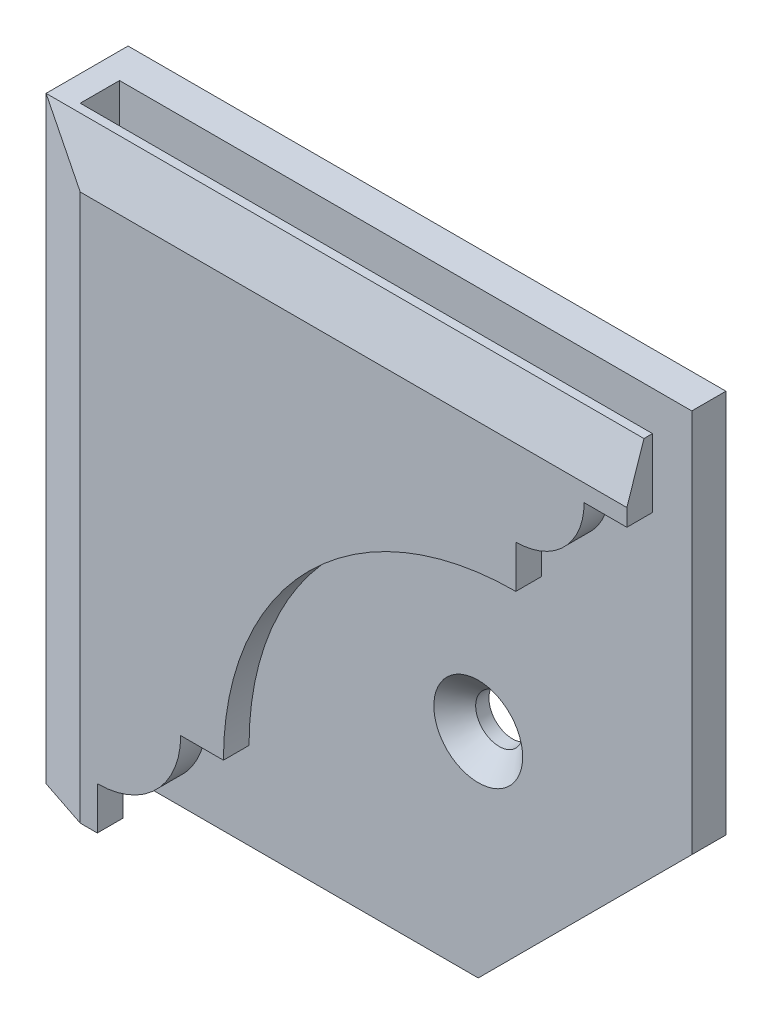
ISO-10303-21;
HEADER;
FILE_DESCRIPTION(('STEP AP214'),'2;1');
FILE_NAME('part.step','',(''),(''),'','','');
FILE_SCHEMA(('AUTOMOTIVE_DESIGN { 1 0 10303 214 1 1 1 1 }'));
ENDSEC;
DATA;
#1=APPLICATION_CONTEXT('core data for automotive mechanical design processes');
#2=APPLICATION_PROTOCOL_DEFINITION('international standard','automotive_design',2000,#1);
#3=PRODUCT_CONTEXT('',#1,'mechanical');
#4=PRODUCT('Part','Part','',(#3));
#5=PRODUCT_RELATED_PRODUCT_CATEGORY('part','',(#4));
#6=PRODUCT_DEFINITION_FORMATION('','',#4);
#7=PRODUCT_DEFINITION_CONTEXT('part definition',#1,'design');
#8=PRODUCT_DEFINITION('design','',#6,#7);
#9=PRODUCT_DEFINITION_SHAPE('','',#8);
#10=(LENGTH_UNIT() NAMED_UNIT(*) SI_UNIT(.MILLI.,.METRE.));
#11=(NAMED_UNIT(*) PLANE_ANGLE_UNIT() SI_UNIT($,.RADIAN.));
#12=(NAMED_UNIT(*) SI_UNIT($,.STERADIAN.) SOLID_ANGLE_UNIT());
#13=UNCERTAINTY_MEASURE_WITH_UNIT(LENGTH_MEASURE(1.E-05),#10,'distance_accuracy_value','');
#14=(GEOMETRIC_REPRESENTATION_CONTEXT(3) GLOBAL_UNCERTAINTY_ASSIGNED_CONTEXT((#13)) GLOBAL_UNIT_ASSIGNED_CONTEXT((#10,
#11,#12)) REPRESENTATION_CONTEXT('',''));
#15=CARTESIAN_POINT('',(0.,0.,0.));
#16=DIRECTION('',(0.,0.,1.));
#17=DIRECTION('',(1.,0.,0.));
#18=AXIS2_PLACEMENT_3D('',#15,#16,#17);
#19=CARTESIAN_POINT('',(35.,-35.,4.));
#20=DIRECTION('',(-1.,0.,0.));
#21=DIRECTION('',(0.,0.,1.));
#22=AXIS2_PLACEMENT_3D('',#19,#20,#21);
#23=PLANE('',#22);
#24=DIRECTION('',(0.,1.,0.));
#25=VECTOR('',#24,1.);
#26=CARTESIAN_POINT('',(35.,35.,8.6));
#27=LINE('',#26,#25);
#28=CARTESIAN_POINT('',(35.,27.,8.6));
#29=VERTEX_POINT('',#28);
#30=CARTESIAN_POINT('',(35.,35.,8.6));
#31=VERTEX_POINT('',#30);
#32=EDGE_CURVE('E219',#29,#31,#27,.T.);
#33=ORIENTED_EDGE('',*,*,#32,.T.);
#34=DIRECTION('',(0.,0.,-1.));
#35=VECTOR('',#34,1.);
#36=CARTESIAN_POINT('',(35.,35.,4.));
#37=LINE('',#36,#35);
#38=CARTESIAN_POINT('',(35.,35.,9.59999999999999));
#39=VERTEX_POINT('',#38);
#40=EDGE_CURVE('E259',#39,#31,#37,.T.);
#41=ORIENTED_EDGE('',*,*,#40,.F.);
#42=DIRECTION('',(0.,0.948683298050515,-0.316227766016836));
#43=VECTOR('',#42,1.);
#44=CARTESIAN_POINT('',(35.,28.9999999999999,11.6));
#45=LINE('',#44,#43);
#46=CARTESIAN_POINT('',(35.,28.9999999999999,11.6));
#47=VERTEX_POINT('',#46);
#48=EDGE_CURVE('E239',#39,#47,#45,.F.);
#49=ORIENTED_EDGE('',*,*,#48,.T.);
#50=DIRECTION('',(0.,1.,0.));
#51=VECTOR('',#50,1.);
#52=CARTESIAN_POINT('',(35.,35.,11.6));
#53=LINE('',#52,#51);
#54=CARTESIAN_POINT('',(35.,27.,11.6));
#55=VERTEX_POINT('',#54);
#56=EDGE_CURVE('E193',#55,#47,#53,.T.);
#57=ORIENTED_EDGE('',*,*,#56,.F.);
#58=DIRECTION('',(0.,0.,-1.));
#59=VECTOR('',#58,1.);
#60=CARTESIAN_POINT('',(35.,27.,11.6));
#61=LINE('',#60,#59);
#62=EDGE_CURVE('E213',#55,#29,#61,.T.);
#63=ORIENTED_EDGE('',*,*,#62,.T.);
#64=EDGE_LOOP('',(#33,#41,#49,#57,#63));
#65=FACE_BOUND('',#64,.T.);
#66=ADVANCED_FACE('F34',(#65),#23,.F.);
#67=CARTESIAN_POINT('',(0.,0.,4.));
#68=DIRECTION('',(0.,0.,-1.));
#69=DIRECTION('',(-1.,0.,0.));
#70=AXIS2_PLACEMENT_3D('',#67,#68,#69);
#71=PLANE('',#70);
#72=CARTESIAN_POINT('',(9.99999999999997,-10.,4.));
#73=DIRECTION('',(0.,0.,1.));
#74=DIRECTION('',(1.,0.,0.));
#75=AXIS2_PLACEMENT_3D('',#72,#73,#74);
#76=CIRCLE('',#75,5.2);
#77=CARTESIAN_POINT('',(15.2,-10.,4.));
#78=VERTEX_POINT('',#77);
#79=EDGE_CURVE('E175',#78,#78,#76,.T.);
#80=ORIENTED_EDGE('',*,*,#79,.F.);
#81=EDGE_LOOP('',(#80));
#82=FACE_BOUND('',#81,.T.);
#83=DIRECTION('',(1.,0.,0.));
#84=VECTOR('',#83,1.);
#85=CARTESIAN_POINT('',(-35.,-35.,4.));
#86=LINE('',#85,#84);
#87=CARTESIAN_POINT('',(-32.,-35.,4.));
#88=VERTEX_POINT('',#87);
#89=CARTESIAN_POINT('',(9.99999999999989,-35.,4.));
#90=VERTEX_POINT('',#89);
#91=EDGE_CURVE('E233',#88,#90,#86,.T.);
#92=ORIENTED_EDGE('',*,*,#91,.T.);
#93=DIRECTION('',(-0.707106781186549,-0.707106781186546,0.));
#94=VECTOR('',#93,1.);
#95=CARTESIAN_POINT('',(35.,-10.,4.));
#96=LINE('',#95,#94);
#97=CARTESIAN_POINT('',(35.,-10.,4.));
#98=VERTEX_POINT('',#97);
#99=EDGE_CURVE('E11',#90,#98,#96,.F.);
#100=ORIENTED_EDGE('',*,*,#99,.T.);
#101=DIRECTION('',(0.,1.,0.));
#102=VECTOR('',#101,1.);
#103=CARTESIAN_POINT('',(35.,-35.,4.));
#104=LINE('',#103,#102);
#105=CARTESIAN_POINT('',(35.,35.,4.));
#106=VERTEX_POINT('',#105);
#107=EDGE_CURVE('E172',#98,#106,#104,.T.);
#108=ORIENTED_EDGE('',*,*,#107,.T.);
#109=DIRECTION('',(-1.,0.,0.));
#110=VECTOR('',#109,1.);
#111=CARTESIAN_POINT('',(-32.,35.,4.));
#112=LINE('',#111,#110);
#113=CARTESIAN_POINT('',(-32.,35.,4.));
#114=VERTEX_POINT('',#113);
#115=EDGE_CURVE('E169',#106,#114,#112,.T.);
#116=ORIENTED_EDGE('',*,*,#115,.T.);
#117=DIRECTION('',(0.,1.,0.));
#118=VECTOR('',#117,1.);
#119=CARTESIAN_POINT('',(-32.,-35.,4.));
#120=LINE('',#119,#118);
#121=EDGE_CURVE('E156',#88,#114,#120,.T.);
#122=ORIENTED_EDGE('',*,*,#121,.F.);
#123=EDGE_LOOP('',(#92,#100,#108,#116,#122));
#124=FACE_BOUND('',#123,.T.);
#125=ADVANCED_FACE('F170',(#82,#124),#71,.F.);
#126=CARTESIAN_POINT('',(35.,35.,0.));
#127=VERTEX_POINT('',#126);
#128=EDGE_CURVE('E272',#106,#127,#37,.T.);
#129=ORIENTED_EDGE('',*,*,#128,.F.);
#130=ORIENTED_EDGE('',*,*,#107,.F.);
#131=DIRECTION('',(0.,0.,-1.));
#132=VECTOR('',#131,1.);
#133=CARTESIAN_POINT('',(35.,-10.,4.));
#134=LINE('',#133,#132);
#135=CARTESIAN_POINT('',(35.,-10.,0.));
#136=VERTEX_POINT('',#135);
#137=EDGE_CURVE('E236',#98,#136,#134,.T.);
#138=ORIENTED_EDGE('',*,*,#137,.T.);
#139=DIRECTION('',(0.,1.,0.));
#140=VECTOR('',#139,1.);
#141=CARTESIAN_POINT('',(35.,-35.,0.));
#142=LINE('',#141,#140);
#143=EDGE_CURVE('E266',#136,#127,#142,.T.);
#144=ORIENTED_EDGE('',*,*,#143,.T.);
#145=EDGE_LOOP('',(#129,#130,#138,#144));
#146=FACE_BOUND('',#145,.T.);
#147=ADVANCED_FACE('F283',(#146),#23,.F.);
#148=CARTESIAN_POINT('',(-35.,35.,4.));
#149=DIRECTION('',(0.,-1.,0.));
#150=DIRECTION('',(0.,0.,-1.));
#151=AXIS2_PLACEMENT_3D('',#148,#149,#150);
#152=PLANE('',#151);
#153=ORIENTED_EDGE('',*,*,#40,.T.);
#154=DIRECTION('',(1.,0.,0.));
#155=VECTOR('',#154,1.);
#156=CARTESIAN_POINT('',(35.,35.,8.6));
#157=LINE('',#156,#155);
#158=CARTESIAN_POINT('',(-32.,35.,8.6));
#159=VERTEX_POINT('',#158);
#160=EDGE_CURVE('E176',#159,#31,#157,.T.);
#161=ORIENTED_EDGE('',*,*,#160,.F.);
#162=DIRECTION('',(0.,0.,1.));
#163=VECTOR('',#162,1.);
#164=CARTESIAN_POINT('',(-32.,35.,8.6));
#165=LINE('',#164,#163);
#166=EDGE_CURVE('E161',#114,#159,#165,.T.);
#167=ORIENTED_EDGE('',*,*,#166,.F.);
#168=ORIENTED_EDGE('',*,*,#115,.F.);
#169=ORIENTED_EDGE('',*,*,#128,.T.);
#170=DIRECTION('',(-1.,0.,0.));
#171=VECTOR('',#170,1.);
#172=CARTESIAN_POINT('',(-35.,35.,0.));
#173=LINE('',#172,#171);
#174=CARTESIAN_POINT('',(-35.,35.,0.));
#175=VERTEX_POINT('',#174);
#176=EDGE_CURVE('E280',#127,#175,#173,.T.);
#177=ORIENTED_EDGE('',*,*,#176,.T.);
#178=DIRECTION('',(0.,0.,-1.));
#179=VECTOR('',#178,1.);
#180=CARTESIAN_POINT('',(-35.,35.,4.));
#181=LINE('',#180,#179);
#182=CARTESIAN_POINT('',(-35.,35.,9.59999999999999));
#183=VERTEX_POINT('',#182);
#184=EDGE_CURVE('E273',#183,#175,#181,.T.);
#185=ORIENTED_EDGE('',*,*,#184,.F.);
#186=DIRECTION('',(1.,0.,0.));
#187=VECTOR('',#186,1.);
#188=CARTESIAN_POINT('',(-35.,35.,9.59999999999999));
#189=LINE('',#188,#187);
#190=EDGE_CURVE('E243',#183,#39,#189,.T.);
#191=ORIENTED_EDGE('',*,*,#190,.T.);
#192=EDGE_LOOP('',(#153,#161,#167,#168,#169,#177,#185,#191));
#193=FACE_BOUND('',#192,.T.);
#194=ADVANCED_FACE('F179',(#193),#152,.F.);
#195=CARTESIAN_POINT('',(-35.,-35.,4.));
#196=DIRECTION('',(1.,0.,0.));
#197=DIRECTION('',(0.,0.,-1.));
#198=AXIS2_PLACEMENT_3D('',#195,#196,#197);
#199=PLANE('',#198);
#200=DIRECTION('',(0.,0.,-1.));
#201=VECTOR('',#200,1.);
#202=CARTESIAN_POINT('',(-35.,-35.,4.));
#203=LINE('',#202,#201);
#204=CARTESIAN_POINT('',(-35.,-35.,9.59999999999999));
#205=VERTEX_POINT('',#204);
#206=CARTESIAN_POINT('',(-35.,-35.,0.));
#207=VERTEX_POINT('',#206);
#208=EDGE_CURVE('E270',#205,#207,#203,.T.);
#209=ORIENTED_EDGE('',*,*,#208,.F.);
#210=DIRECTION('',(0.,1.,0.));
#211=VECTOR('',#210,1.);
#212=CARTESIAN_POINT('',(-35.,-35.,9.59999999999999));
#213=LINE('',#212,#211);
#214=EDGE_CURVE('E248',#205,#183,#213,.T.);
#215=ORIENTED_EDGE('',*,*,#214,.T.);
#216=ORIENTED_EDGE('',*,*,#184,.T.);
#217=DIRECTION('',(0.,-1.,0.));
#218=VECTOR('',#217,1.);
#219=CARTESIAN_POINT('',(-35.,-35.,0.));
#220=LINE('',#219,#218);
#221=EDGE_CURVE('E277',#175,#207,#220,.T.);
#222=ORIENTED_EDGE('',*,*,#221,.T.);
#223=EDGE_LOOP('',(#209,#215,#216,#222));
#224=FACE_BOUND('',#223,.T.);
#225=ADVANCED_FACE('F398',(#224),#199,.F.);
#226=CARTESIAN_POINT('',(-35.,-35.,4.));
#227=DIRECTION('',(0.,1.,0.));
#228=DIRECTION('',(0.,0.,1.));
#229=AXIS2_PLACEMENT_3D('',#226,#227,#228);
#230=PLANE('',#229);
#231=DIRECTION('',(1.,0.,0.));
#232=VECTOR('',#231,1.);
#233=CARTESIAN_POINT('',(-35.,-35.,0.));
#234=LINE('',#233,#232);
#235=CARTESIAN_POINT('',(9.99999999999988,-35.,0.));
#236=VERTEX_POINT('',#235);
#237=EDGE_CURVE('E234',#207,#236,#234,.T.);
#238=ORIENTED_EDGE('',*,*,#237,.T.);
#239=DIRECTION('',(0.,0.,1.));
#240=VECTOR('',#239,1.);
#241=CARTESIAN_POINT('',(9.99999999999988,-35.,4.));
#242=LINE('',#241,#240);
#243=EDGE_CURVE('E42',#236,#90,#242,.T.);
#244=ORIENTED_EDGE('',*,*,#243,.T.);
#245=ORIENTED_EDGE('',*,*,#91,.F.);
#246=DIRECTION('',(0.,0.,-1.));
#247=VECTOR('',#246,1.);
#248=CARTESIAN_POINT('',(-32.,-35.,8.6));
#249=LINE('',#248,#247);
#250=CARTESIAN_POINT('',(-32.,-35.,8.6));
#251=VERTEX_POINT('',#250);
#252=EDGE_CURVE('E163',#251,#88,#249,.T.);
#253=ORIENTED_EDGE('',*,*,#252,.F.);
#254=DIRECTION('',(1.,0.,0.));
#255=VECTOR('',#254,1.);
#256=CARTESIAN_POINT('',(-27.,-35.,8.6));
#257=LINE('',#256,#255);
#258=CARTESIAN_POINT('',(-27.,-35.,8.6));
#259=VERTEX_POINT('',#258);
#260=EDGE_CURVE('E222',#251,#259,#257,.T.);
#261=ORIENTED_EDGE('',*,*,#260,.T.);
#262=DIRECTION('',(0.,0.,-1.));
#263=VECTOR('',#262,1.);
#264=CARTESIAN_POINT('',(-27.,-35.,11.6));
#265=LINE('',#264,#263);
#266=CARTESIAN_POINT('',(-27.,-35.,11.6));
#267=VERTEX_POINT('',#266);
#268=EDGE_CURVE('E166',#267,#259,#265,.T.);
#269=ORIENTED_EDGE('',*,*,#268,.F.);
#270=DIRECTION('',(1.,0.,0.));
#271=VECTOR('',#270,1.);
#272=CARTESIAN_POINT('',(-27.,-35.,11.6));
#273=LINE('',#272,#271);
#274=CARTESIAN_POINT('',(-28.9999999999999,-35.,11.6));
#275=VERTEX_POINT('',#274);
#276=EDGE_CURVE('E196',#275,#267,#273,.T.);
#277=ORIENTED_EDGE('',*,*,#276,.F.);
#278=DIRECTION('',(0.948683298050515,0.,0.316227766016835));
#279=VECTOR('',#278,1.);
#280=CARTESIAN_POINT('',(-28.9999999999999,-35.,11.6));
#281=LINE('',#280,#279);
#282=EDGE_CURVE('E252',#275,#205,#281,.F.);
#283=ORIENTED_EDGE('',*,*,#282,.T.);
#284=ORIENTED_EDGE('',*,*,#208,.T.);
#285=EDGE_LOOP('',(#238,#244,#245,#253,#261,#269,#277,#283,#284));
#286=FACE_BOUND('',#285,.T.);
#287=ADVANCED_FACE('F302',(#286),#230,.F.);
#288=CARTESIAN_POINT('',(0.,0.,0.));
#289=DIRECTION('',(0.,0.,-1.));
#290=DIRECTION('',(-1.,0.,0.));
#291=AXIS2_PLACEMENT_3D('',#288,#289,#290);
#292=PLANE('',#291);
#293=CARTESIAN_POINT('',(9.99999999999997,-10.,0.));
#294=DIRECTION('',(0.,0.,-1.));
#295=DIRECTION('',(-1.,0.,0.));
#296=AXIS2_PLACEMENT_3D('',#293,#294,#295);
#297=CIRCLE('',#296,2.75);
#298=CARTESIAN_POINT('',(7.24999999999998,-10.,0.));
#299=VERTEX_POINT('',#298);
#300=EDGE_CURVE('E189',#299,#299,#297,.T.);
#301=ORIENTED_EDGE('',*,*,#300,.F.);
#302=EDGE_LOOP('',(#301));
#303=FACE_BOUND('',#302,.T.);
#304=ORIENTED_EDGE('',*,*,#143,.F.);
#305=DIRECTION('',(0.707106781186549,0.707106781186546,0.));
#306=VECTOR('',#305,1.);
#307=CARTESIAN_POINT('',(22.4999999999999,-22.5,0.));
#308=LINE('',#307,#306);
#309=EDGE_CURVE('E56',#136,#236,#308,.F.);
#310=ORIENTED_EDGE('',*,*,#309,.T.);
#311=ORIENTED_EDGE('',*,*,#237,.F.);
#312=ORIENTED_EDGE('',*,*,#221,.F.);
#313=ORIENTED_EDGE('',*,*,#176,.F.);
#314=EDGE_LOOP('',(#304,#310,#311,#312,#313));
#315=FACE_BOUND('',#314,.T.);
#316=ADVANCED_FACE('F285',(#303,#315),#292,.T.);
#317=CARTESIAN_POINT('',(-32.,-35.,8.6));
#318=DIRECTION('',(-1.,0.,0.));
#319=DIRECTION('',(0.,-1.,0.));
#320=AXIS2_PLACEMENT_3D('',#317,#318,#319);
#321=PLANE('',#320);
#322=ORIENTED_EDGE('',*,*,#121,.T.);
#323=ORIENTED_EDGE('',*,*,#166,.T.);
#324=DIRECTION('',(0.,1.,0.));
#325=VECTOR('',#324,1.);
#326=CARTESIAN_POINT('',(-32.,-35.,8.6));
#327=LINE('',#326,#325);
#328=EDGE_CURVE('E165',#251,#159,#327,.T.);
#329=ORIENTED_EDGE('',*,*,#328,.F.);
#330=ORIENTED_EDGE('',*,*,#252,.T.);
#331=EDGE_LOOP('',(#322,#323,#329,#330));
#332=FACE_BOUND('',#331,.T.);
#333=ADVANCED_FACE('F158',(#332),#321,.F.);
#334=CARTESIAN_POINT('',(-27.,-30.,11.6));
#335=DIRECTION('',(-1.,0.,0.));
#336=DIRECTION('',(0.,-1.,0.));
#337=AXIS2_PLACEMENT_3D('',#334,#335,#336);
#338=PLANE('',#337);
#339=DIRECTION('',(0.,1.,0.));
#340=VECTOR('',#339,1.);
#341=CARTESIAN_POINT('',(-27.,-30.,8.6));
#342=LINE('',#341,#340);
#343=CARTESIAN_POINT('',(-27.,-30.,8.6));
#344=VERTEX_POINT('',#343);
#345=EDGE_CURVE('E225',#259,#344,#342,.T.);
#346=ORIENTED_EDGE('',*,*,#345,.T.);
#347=DIRECTION('',(0.,0.,-1.));
#348=VECTOR('',#347,1.);
#349=CARTESIAN_POINT('',(-27.,-30.,11.6));
#350=LINE('',#349,#348);
#351=CARTESIAN_POINT('',(-27.,-30.,11.6));
#352=VERTEX_POINT('',#351);
#353=EDGE_CURVE('E309',#352,#344,#350,.T.);
#354=ORIENTED_EDGE('',*,*,#353,.F.);
#355=DIRECTION('',(0.,1.,0.));
#356=VECTOR('',#355,1.);
#357=CARTESIAN_POINT('',(-27.,-30.,11.6));
#358=LINE('',#357,#356);
#359=EDGE_CURVE('E199',#267,#352,#358,.T.);
#360=ORIENTED_EDGE('',*,*,#359,.F.);
#361=ORIENTED_EDGE('',*,*,#268,.T.);
#362=EDGE_LOOP('',(#346,#354,#360,#361));
#363=FACE_BOUND('',#362,.T.);
#364=ADVANCED_FACE('F311',(#363),#338,.F.);
#365=CARTESIAN_POINT('',(-27.,-20.2350157811186,11.6));
#366=DIRECTION('',(0.,0.,-1.));
#367=DIRECTION('',(-1.,0.,0.));
#368=AXIS2_PLACEMENT_3D('',#365,#366,#367);
#369=CYLINDRICAL_SURFACE('',#368,9.76498421888135);
#370=CARTESIAN_POINT('',(-27.,-20.2350157811186,8.6));
#371=DIRECTION('',(0.,0.,1.));
#372=DIRECTION('',(-1.,0.,0.));
#373=AXIS2_PLACEMENT_3D('',#370,#371,#372);
#374=CIRCLE('',#373,9.76498421888135);
#375=CARTESIAN_POINT('',(-17.2350157811187,-20.2350157811186,8.6));
#376=VERTEX_POINT('',#375);
#377=EDGE_CURVE('E322',#344,#376,#374,.T.);
#378=ORIENTED_EDGE('',*,*,#377,.T.);
#379=DIRECTION('',(0.,0.,-1.));
#380=VECTOR('',#379,1.);
#381=CARTESIAN_POINT('',(-17.2350157811187,-20.2350157811186,11.6));
#382=LINE('',#381,#380);
#383=CARTESIAN_POINT('',(-17.2350157811187,-20.2350157811186,11.6));
#384=VERTEX_POINT('',#383);
#385=EDGE_CURVE('E319',#384,#376,#382,.T.);
#386=ORIENTED_EDGE('',*,*,#385,.F.);
#387=CARTESIAN_POINT('',(-27.,-20.2350157811186,11.6));
#388=DIRECTION('',(0.,0.,1.));
#389=DIRECTION('',(-1.,0.,0.));
#390=AXIS2_PLACEMENT_3D('',#387,#388,#389);
#391=CIRCLE('',#390,9.76498421888135);
#392=EDGE_CURVE('E201',#352,#384,#391,.T.);
#393=ORIENTED_EDGE('',*,*,#392,.F.);
#394=ORIENTED_EDGE('',*,*,#353,.T.);
#395=EDGE_LOOP('',(#378,#386,#393,#394));
#396=FACE_BOUND('',#395,.T.);
#397=ADVANCED_FACE('F320',(#396),#369,.T.);
#398=CARTESIAN_POINT('',(-12.2350157811187,-20.2350157811186,11.6));
#399=DIRECTION('',(0.,1.,0.));
#400=DIRECTION('',(0.,0.,1.));
#401=AXIS2_PLACEMENT_3D('',#398,#399,#400);
#402=PLANE('',#401);
#403=DIRECTION('',(1.,0.,0.));
#404=VECTOR('',#403,1.);
#405=CARTESIAN_POINT('',(-12.2350157811187,-20.2350157811186,8.6));
#406=LINE('',#405,#404);
#407=CARTESIAN_POINT('',(-12.2350157811187,-20.2350157811186,8.6));
#408=VERTEX_POINT('',#407);
#409=EDGE_CURVE('E330',#376,#408,#406,.T.);
#410=ORIENTED_EDGE('',*,*,#409,.T.);
#411=DIRECTION('',(0.,0.,-1.));
#412=VECTOR('',#411,1.);
#413=CARTESIAN_POINT('',(-12.2350157811187,-20.2350157811186,11.6));
#414=LINE('',#413,#412);
#415=CARTESIAN_POINT('',(-12.2350157811187,-20.2350157811186,11.6));
#416=VERTEX_POINT('',#415);
#417=EDGE_CURVE('E325',#416,#408,#414,.T.);
#418=ORIENTED_EDGE('',*,*,#417,.F.);
#419=DIRECTION('',(1.,0.,0.));
#420=VECTOR('',#419,1.);
#421=CARTESIAN_POINT('',(-12.2350157811187,-20.2350157811186,11.6));
#422=LINE('',#421,#420);
#423=EDGE_CURVE('E203',#384,#416,#422,.T.);
#424=ORIENTED_EDGE('',*,*,#423,.F.);
#425=ORIENTED_EDGE('',*,*,#385,.T.);
#426=EDGE_LOOP('',(#410,#418,#424,#425));
#427=FACE_BOUND('',#426,.T.);
#428=ADVANCED_FACE('F327',(#427),#402,.F.);
#429=CARTESIAN_POINT('',(22.,-20.2350157811186,11.6));
#430=DIRECTION('',(0.,0.,-1.));
#431=DIRECTION('',(-1.,0.,0.));
#432=AXIS2_PLACEMENT_3D('',#429,#430,#431);
#433=CYLINDRICAL_SURFACE('',#432,34.2350157811186);
#434=CARTESIAN_POINT('',(22.,-20.2350157811186,8.6));
#435=DIRECTION('',(0.,0.,-1.));
#436=DIRECTION('',(1.,0.,0.));
#437=AXIS2_PLACEMENT_3D('',#434,#435,#436);
#438=CIRCLE('',#437,34.2350157811186);
#439=CARTESIAN_POINT('',(22.,14.,8.6));
#440=VERTEX_POINT('',#439);
#441=EDGE_CURVE('E369',#408,#440,#438,.T.);
#442=ORIENTED_EDGE('',*,*,#441,.T.);
#443=DIRECTION('',(0.,0.,-1.));
#444=VECTOR('',#443,1.);
#445=CARTESIAN_POINT('',(22.,14.,11.6));
#446=LINE('',#445,#444);
#447=CARTESIAN_POINT('',(22.,14.,11.6));
#448=VERTEX_POINT('',#447);
#449=EDGE_CURVE('E333',#448,#440,#446,.T.);
#450=ORIENTED_EDGE('',*,*,#449,.F.);
#451=CARTESIAN_POINT('',(22.,-20.2350157811186,11.6));
#452=DIRECTION('',(0.,0.,-1.));
#453=DIRECTION('',(1.,0.,0.));
#454=AXIS2_PLACEMENT_3D('',#451,#452,#453);
#455=CIRCLE('',#454,34.2350157811186);
#456=EDGE_CURVE('E205',#416,#448,#455,.T.);
#457=ORIENTED_EDGE('',*,*,#456,.F.);
#458=ORIENTED_EDGE('',*,*,#417,.T.);
#459=EDGE_LOOP('',(#442,#450,#457,#458));
#460=FACE_BOUND('',#459,.T.);
#461=ADVANCED_FACE('F336',(#460),#433,.F.);
#462=CARTESIAN_POINT('',(22.,19.,11.6));
#463=DIRECTION('',(-1.,0.,0.));
#464=DIRECTION('',(0.,0.,1.));
#465=AXIS2_PLACEMENT_3D('',#462,#463,#464);
#466=PLANE('',#465);
#467=DIRECTION('',(0.,1.,0.));
#468=VECTOR('',#467,1.);
#469=CARTESIAN_POINT('',(22.,19.,8.6));
#470=LINE('',#469,#468);
#471=CARTESIAN_POINT('',(22.,19.,8.6));
#472=VERTEX_POINT('',#471);
#473=EDGE_CURVE('E347',#440,#472,#470,.T.);
#474=ORIENTED_EDGE('',*,*,#473,.T.);
#475=DIRECTION('',(0.,0.,-1.));
#476=VECTOR('',#475,1.);
#477=CARTESIAN_POINT('',(22.,19.,11.6));
#478=LINE('',#477,#476);
#479=CARTESIAN_POINT('',(22.,19.,11.6));
#480=VERTEX_POINT('',#479);
#481=EDGE_CURVE('E344',#480,#472,#478,.T.);
#482=ORIENTED_EDGE('',*,*,#481,.F.);
#483=DIRECTION('',(0.,1.,0.));
#484=VECTOR('',#483,1.);
#485=CARTESIAN_POINT('',(22.,19.,11.6));
#486=LINE('',#485,#484);
#487=EDGE_CURVE('E207',#448,#480,#486,.T.);
#488=ORIENTED_EDGE('',*,*,#487,.F.);
#489=ORIENTED_EDGE('',*,*,#449,.T.);
#490=EDGE_LOOP('',(#474,#482,#488,#489));
#491=FACE_BOUND('',#490,.T.);
#492=ADVANCED_FACE('F345',(#491),#466,.F.);
#493=CARTESIAN_POINT('',(22.,27.,11.6));
#494=DIRECTION('',(0.,0.,-1.));
#495=DIRECTION('',(-1.,0.,0.));
#496=AXIS2_PLACEMENT_3D('',#493,#494,#495);
#497=CYLINDRICAL_SURFACE('',#496,8.);
#498=CARTESIAN_POINT('',(22.,27.,8.6));
#499=DIRECTION('',(0.,0.,1.));
#500=DIRECTION('',(-1.,0.,0.));
#501=AXIS2_PLACEMENT_3D('',#498,#499,#500);
#502=CIRCLE('',#501,8.);
#503=CARTESIAN_POINT('',(30.,27.,8.6));
#504=VERTEX_POINT('',#503);
#505=EDGE_CURVE('E355',#472,#504,#502,.T.);
#506=ORIENTED_EDGE('',*,*,#505,.T.);
#507=DIRECTION('',(0.,0.,-1.));
#508=VECTOR('',#507,1.);
#509=CARTESIAN_POINT('',(30.,27.,11.6));
#510=LINE('',#509,#508);
#511=CARTESIAN_POINT('',(30.,27.,11.6));
#512=VERTEX_POINT('',#511);
#513=EDGE_CURVE('E350',#512,#504,#510,.T.);
#514=ORIENTED_EDGE('',*,*,#513,.F.);
#515=CARTESIAN_POINT('',(22.,27.,11.6));
#516=DIRECTION('',(0.,0.,1.));
#517=DIRECTION('',(-1.,0.,0.));
#518=AXIS2_PLACEMENT_3D('',#515,#516,#517);
#519=CIRCLE('',#518,8.);
#520=EDGE_CURVE('E209',#480,#512,#519,.T.);
#521=ORIENTED_EDGE('',*,*,#520,.F.);
#522=ORIENTED_EDGE('',*,*,#481,.T.);
#523=EDGE_LOOP('',(#506,#514,#521,#522));
#524=FACE_BOUND('',#523,.T.);
#525=ADVANCED_FACE('F352',(#524),#497,.T.);
#526=CARTESIAN_POINT('',(35.,27.,11.6));
#527=DIRECTION('',(0.,1.,0.));
#528=DIRECTION('',(-1.,0.,0.));
#529=AXIS2_PLACEMENT_3D('',#526,#527,#528);
#530=PLANE('',#529);
#531=DIRECTION('',(1.,0.,0.));
#532=VECTOR('',#531,1.);
#533=CARTESIAN_POINT('',(35.,27.,8.6));
#534=LINE('',#533,#532);
#535=EDGE_CURVE('E197',#504,#29,#534,.T.);
#536=ORIENTED_EDGE('',*,*,#535,.T.);
#537=ORIENTED_EDGE('',*,*,#62,.F.);
#538=DIRECTION('',(1.,0.,0.));
#539=VECTOR('',#538,1.);
#540=CARTESIAN_POINT('',(35.,27.,11.6));
#541=LINE('',#540,#539);
#542=EDGE_CURVE('E211',#512,#55,#541,.T.);
#543=ORIENTED_EDGE('',*,*,#542,.F.);
#544=ORIENTED_EDGE('',*,*,#513,.T.);
#545=EDGE_LOOP('',(#536,#537,#543,#544));
#546=FACE_BOUND('',#545,.T.);
#547=ADVANCED_FACE('F360',(#546),#530,.F.);
#548=CARTESIAN_POINT('',(22.,27.,11.6));
#549=DIRECTION('',(0.,0.,-1.));
#550=DIRECTION('',(-1.,0.,0.));
#551=AXIS2_PLACEMENT_3D('',#548,#549,#550);
#552=PLANE('',#551);
#553=DIRECTION('',(-1.,0.,0.));
#554=VECTOR('',#553,1.);
#555=CARTESIAN_POINT('',(22.,28.9999999999999,11.6));
#556=LINE('',#555,#554);
#557=CARTESIAN_POINT('',(-28.9999999999999,28.9999999999999,11.6));
#558=VERTEX_POINT('',#557);
#559=EDGE_CURVE('E257',#47,#558,#556,.T.);
#560=ORIENTED_EDGE('',*,*,#559,.T.);
#561=DIRECTION('',(0.,-1.,0.));
#562=VECTOR('',#561,1.);
#563=CARTESIAN_POINT('',(-28.9999999999999,27.,11.6));
#564=LINE('',#563,#562);
#565=EDGE_CURVE('E254',#558,#275,#564,.T.);
#566=ORIENTED_EDGE('',*,*,#565,.T.);
#567=ORIENTED_EDGE('',*,*,#276,.T.);
#568=ORIENTED_EDGE('',*,*,#359,.T.);
#569=ORIENTED_EDGE('',*,*,#392,.T.);
#570=ORIENTED_EDGE('',*,*,#423,.T.);
#571=ORIENTED_EDGE('',*,*,#456,.T.);
#572=ORIENTED_EDGE('',*,*,#487,.T.);
#573=ORIENTED_EDGE('',*,*,#520,.T.);
#574=ORIENTED_EDGE('',*,*,#542,.T.);
#575=ORIENTED_EDGE('',*,*,#56,.T.);
#576=EDGE_LOOP('',(#560,#566,#567,#568,#569,#570,#571,#572,#573,#574,#575));
#577=FACE_BOUND('',#576,.T.);
#578=ADVANCED_FACE('F300',(#577),#552,.F.);
#579=CARTESIAN_POINT('',(22.,27.,8.6));
#580=DIRECTION('',(0.,0.,-1.));
#581=DIRECTION('',(-1.,0.,0.));
#582=AXIS2_PLACEMENT_3D('',#579,#580,#581);
#583=PLANE('',#582);
#584=ORIENTED_EDGE('',*,*,#260,.F.);
#585=ORIENTED_EDGE('',*,*,#328,.T.);
#586=ORIENTED_EDGE('',*,*,#160,.T.);
#587=ORIENTED_EDGE('',*,*,#32,.F.);
#588=ORIENTED_EDGE('',*,*,#535,.F.);
#589=ORIENTED_EDGE('',*,*,#505,.F.);
#590=ORIENTED_EDGE('',*,*,#473,.F.);
#591=ORIENTED_EDGE('',*,*,#441,.F.);
#592=ORIENTED_EDGE('',*,*,#409,.F.);
#593=ORIENTED_EDGE('',*,*,#377,.F.);
#594=ORIENTED_EDGE('',*,*,#345,.F.);
#595=EDGE_LOOP('',(#584,#585,#586,#587,#588,#589,#590,#591,#592,#593,#594));
#596=FACE_BOUND('',#595,.T.);
#597=ADVANCED_FACE('F365',(#596),#583,.T.);
#598=CARTESIAN_POINT('',(22.,28.9999999999999,11.6));
#599=DIRECTION('',(0.,-0.316227766016836,-0.948683298050515));
#600=DIRECTION('',(-1.,0.,0.));
#601=AXIS2_PLACEMENT_3D('',#598,#599,#600);
#602=PLANE('',#601);
#603=ORIENTED_EDGE('',*,*,#48,.F.);
#604=ORIENTED_EDGE('',*,*,#190,.F.);
#605=DIRECTION('',(0.688247201611686,-0.688247201611686,0.22941573387056));
#606=VECTOR('',#605,1.);
#607=CARTESIAN_POINT('',(-4.84210526315785,4.84210526315784,19.6526315789473));
#608=LINE('',#607,#606);
#609=EDGE_CURVE('E192',#558,#183,#608,.F.);
#610=ORIENTED_EDGE('',*,*,#609,.F.);
#611=ORIENTED_EDGE('',*,*,#559,.F.);
#612=EDGE_LOOP('',(#603,#604,#610,#611));
#613=FACE_BOUND('',#612,.T.);
#614=ADVANCED_FACE('F292',(#613),#602,.F.);
#615=CARTESIAN_POINT('',(-28.9999999999999,27.,11.6));
#616=DIRECTION('',(0.316227766016835,0.,-0.948683298050515));
#617=DIRECTION('',(0.,-1.,0.));
#618=AXIS2_PLACEMENT_3D('',#615,#616,#617);
#619=PLANE('',#618);
#620=ORIENTED_EDGE('',*,*,#609,.T.);
#621=ORIENTED_EDGE('',*,*,#214,.F.);
#622=ORIENTED_EDGE('',*,*,#282,.F.);
#623=ORIENTED_EDGE('',*,*,#565,.F.);
#624=EDGE_LOOP('',(#620,#621,#622,#623));
#625=FACE_BOUND('',#624,.T.);
#626=ADVANCED_FACE('F297',(#625),#619,.F.);
#627=CARTESIAN_POINT('',(35.,-10.,4.));
#628=DIRECTION('',(-0.707106781186546,0.707106781186549,0.));
#629=DIRECTION('',(0.,0.,-1.));
#630=AXIS2_PLACEMENT_3D('',#627,#628,#629);
#631=PLANE('',#630);
#632=ORIENTED_EDGE('',*,*,#99,.F.);
#633=ORIENTED_EDGE('',*,*,#243,.F.);
#634=ORIENTED_EDGE('',*,*,#309,.F.);
#635=ORIENTED_EDGE('',*,*,#137,.F.);
#636=EDGE_LOOP('',(#632,#633,#634,#635));
#637=FACE_BOUND('',#636,.T.);
#638=ADVANCED_FACE('F36',(#637),#631,.F.);
#639=CARTESIAN_POINT('',(9.99999999999997,-10.,4.));
#640=DIRECTION('',(0.,0.,1.));
#641=DIRECTION('',(1.,0.,0.));
#642=AXIS2_PLACEMENT_3D('',#639,#640,#641);
#643=CYLINDRICAL_SURFACE('',#642,2.75);
#644=CARTESIAN_POINT('',(9.99999999999997,-10.,1.55));
#645=DIRECTION('',(0.,0.,1.));
#646=DIRECTION('',(1.,0.,0.));
#647=AXIS2_PLACEMENT_3D('',#644,#645,#646);
#648=CIRCLE('',#647,2.75);
#649=CARTESIAN_POINT('',(12.75,-10.,1.55));
#650=VERTEX_POINT('',#649);
#651=EDGE_CURVE('E186',#650,#650,#648,.T.);
#652=ORIENTED_EDGE('',*,*,#651,.T.);
#653=EDGE_LOOP('',(#652));
#654=FACE_BOUND('',#653,.T.);
#655=ORIENTED_EDGE('',*,*,#300,.T.);
#656=EDGE_LOOP('',(#655));
#657=FACE_BOUND('',#656,.T.);
#658=ADVANCED_FACE('F448',(#654,#657),#643,.F.);
#659=CARTESIAN_POINT('',(9.99999999999997,-10.,4.));
#660=DIRECTION('',(0.,0.,1.));
#661=DIRECTION('',(1.,0.,0.));
#662=AXIS2_PLACEMENT_3D('',#659,#660,#661);
#663=CONICAL_SURFACE('',#662,5.2,0.785398163397448);
#664=ORIENTED_EDGE('',*,*,#651,.F.);
#665=EDGE_LOOP('',(#664));
#666=FACE_BOUND('',#665,.T.);
#667=ORIENTED_EDGE('',*,*,#79,.T.);
#668=EDGE_LOOP('',(#667));
#669=FACE_BOUND('',#668,.T.);
#670=ADVANCED_FACE('F455',(#666,#669),#663,.F.);
#671=CLOSED_SHELL('',(#66,#125,#147,#194,#225,#287,#316,#333,#364,#397,#428,#461,#492,#525,#547,
#578,#597,#614,#626,#638,#658,#670));
#672=MANIFOLD_SOLID_BREP('B2',#671);
#673=ADVANCED_BREP_SHAPE_REPRESENTATION('',(#18,#672),#14);
#674=SHAPE_DEFINITION_REPRESENTATION(#9,#673);
ENDSEC;
END-ISO-10303-21;
